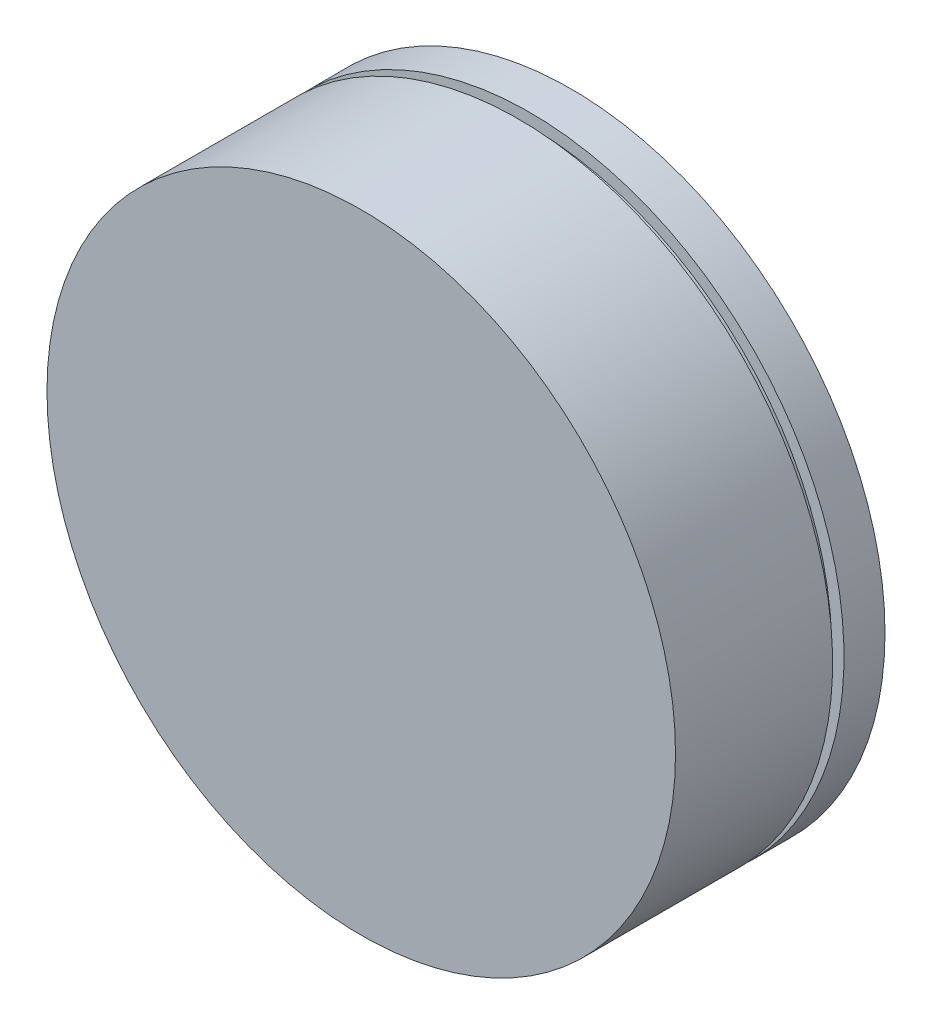
ISO-10303-21;
HEADER;
FILE_DESCRIPTION(('STEP AP214'),'2;1');
FILE_NAME('part.step','',(''),(''),'','','');
FILE_SCHEMA(('AUTOMOTIVE_DESIGN { 1 0 10303 214 1 1 1 1 }'));
ENDSEC;
DATA;
#1=APPLICATION_CONTEXT('core data for automotive mechanical design processes');
#2=APPLICATION_PROTOCOL_DEFINITION('international standard','automotive_design',2000,#1);
#3=PRODUCT_CONTEXT('',#1,'mechanical');
#4=PRODUCT('Part','Part','',(#3));
#5=PRODUCT_RELATED_PRODUCT_CATEGORY('part','',(#4));
#6=PRODUCT_DEFINITION_FORMATION('','',#4);
#7=PRODUCT_DEFINITION_CONTEXT('part definition',#1,'design');
#8=PRODUCT_DEFINITION('design','',#6,#7);
#9=PRODUCT_DEFINITION_SHAPE('','',#8);
#10=(LENGTH_UNIT() NAMED_UNIT(*) SI_UNIT(.MILLI.,.METRE.));
#11=(NAMED_UNIT(*) PLANE_ANGLE_UNIT() SI_UNIT($,.RADIAN.));
#12=(NAMED_UNIT(*) SI_UNIT($,.STERADIAN.) SOLID_ANGLE_UNIT());
#13=UNCERTAINTY_MEASURE_WITH_UNIT(LENGTH_MEASURE(1.E-05),#10,'distance_accuracy_value','');
#14=(GEOMETRIC_REPRESENTATION_CONTEXT(3) GLOBAL_UNCERTAINTY_ASSIGNED_CONTEXT((#13)) GLOBAL_UNIT_ASSIGNED_CONTEXT((#10,
#11,#12)) REPRESENTATION_CONTEXT('',''));
#15=CARTESIAN_POINT('',(0.,0.,0.));
#16=DIRECTION('',(0.,0.,1.));
#17=DIRECTION('',(1.,0.,0.));
#18=AXIS2_PLACEMENT_3D('',#15,#16,#17);
#19=CARTESIAN_POINT('',(0.,0.,25.4));
#20=DIRECTION('',(0.,0.,-1.));
#21=DIRECTION('',(-1.,0.,0.));
#22=AXIS2_PLACEMENT_3D('',#19,#20,#21);
#23=CYLINDRICAL_SURFACE('',#22,38.1);
#24=CARTESIAN_POINT('',(0.,0.,4.97177645782297));
#25=DIRECTION('',(0.,0.,-1.));
#26=DIRECTION('',(-1.,0.,0.));
#27=AXIS2_PLACEMENT_3D('',#24,#25,#26);
#28=CIRCLE('',#27,38.1);
#29=CARTESIAN_POINT('',(-38.1,0.,4.97177645782297));
#30=VERTEX_POINT('',#29);
#31=EDGE_CURVE('E47',#30,#30,#28,.T.);
#32=ORIENTED_EDGE('',*,*,#31,.T.);
#33=EDGE_LOOP('',(#32));
#34=FACE_BOUND('',#33,.T.);
#35=CARTESIAN_POINT('',(0.,0.,0.));
#36=DIRECTION('',(0.,0.,1.));
#37=DIRECTION('',(1.,0.,0.));
#38=AXIS2_PLACEMENT_3D('',#35,#36,#37);
#39=CIRCLE('',#38,38.1);
#40=CARTESIAN_POINT('',(38.1,0.,0.));
#41=VERTEX_POINT('',#40);
#42=EDGE_CURVE('E38',#41,#41,#39,.T.);
#43=ORIENTED_EDGE('',*,*,#42,.T.);
#44=EDGE_LOOP('',(#43));
#45=FACE_BOUND('',#44,.T.);
#46=ADVANCED_FACE('F34',(#34,#45),#23,.T.);
#47=CARTESIAN_POINT('',(0.,0.,0.));
#48=DIRECTION('',(0.,0.,1.));
#49=DIRECTION('',(1.,0.,0.));
#50=AXIS2_PLACEMENT_3D('',#47,#48,#49);
#51=PLANE('',#50);
#52=ORIENTED_EDGE('',*,*,#42,.F.);
#53=EDGE_LOOP('',(#52));
#54=FACE_BOUND('',#53,.T.);
#55=ADVANCED_FACE('F75',(#54),#51,.F.);
#56=CARTESIAN_POINT('',(-38.1,0.,4.97177645782297));
#57=DIRECTION('',(0.,0.,-1.));
#58=DIRECTION('',(-1.,0.,0.));
#59=AXIS2_PLACEMENT_3D('',#56,#57,#58);
#60=PLANE('',#59);
#61=ORIENTED_EDGE('',*,*,#31,.F.);
#62=EDGE_LOOP('',(#61));
#63=FACE_BOUND('',#62,.T.);
#64=CARTESIAN_POINT('',(0.,0.,4.97177645782297));
#65=DIRECTION('',(0.,0.,-1.));
#66=DIRECTION('',(-1.,0.,0.));
#67=AXIS2_PLACEMENT_3D('',#64,#65,#66);
#68=CIRCLE('',#67,36.6234041752429);
#69=CARTESIAN_POINT('',(-36.6234041752429,0.,4.97177645782297));
#70=VERTEX_POINT('',#69);
#71=EDGE_CURVE('E52',#70,#70,#68,.T.);
#72=ORIENTED_EDGE('',*,*,#71,.T.);
#73=EDGE_LOOP('',(#72));
#74=FACE_BOUND('',#73,.T.);
#75=ADVANCED_FACE('F80',(#63,#74),#60,.F.);
#76=CARTESIAN_POINT('',(0.,0.,0.));
#77=DIRECTION('',(0.,0.,-1.));
#78=DIRECTION('',(-1.,0.,0.));
#79=AXIS2_PLACEMENT_3D('',#76,#77,#78);
#80=CYLINDRICAL_SURFACE('',#79,36.6234041752429);
#81=ORIENTED_EDGE('',*,*,#71,.F.);
#82=EDGE_LOOP('',(#81));
#83=FACE_BOUND('',#82,.T.);
#84=CARTESIAN_POINT('',(0.,0.,6.35));
#85=DIRECTION('',(0.,0.,-1.));
#86=DIRECTION('',(-1.,0.,0.));
#87=AXIS2_PLACEMENT_3D('',#84,#85,#86);
#88=CIRCLE('',#87,36.6234041752429);
#89=CARTESIAN_POINT('',(-36.6234041752429,0.,6.35));
#90=VERTEX_POINT('',#89);
#91=EDGE_CURVE('E56',#90,#90,#88,.T.);
#92=ORIENTED_EDGE('',*,*,#91,.T.);
#93=EDGE_LOOP('',(#92));
#94=FACE_BOUND('',#93,.T.);
#95=ADVANCED_FACE('F88',(#83,#94),#80,.T.);
#96=CARTESIAN_POINT('',(-36.6234041752429,0.,6.35));
#97=DIRECTION('',(0.,0.,1.));
#98=DIRECTION('',(1.,0.,0.));
#99=AXIS2_PLACEMENT_3D('',#96,#97,#98);
#100=PLANE('',#99);
#101=ORIENTED_EDGE('',*,*,#91,.F.);
#102=EDGE_LOOP('',(#101));
#103=FACE_BOUND('',#102,.T.);
#104=CARTESIAN_POINT('',(0.,0.,6.35));
#105=DIRECTION('',(0.,0.,-1.));
#106=DIRECTION('',(-1.,0.,0.));
#107=AXIS2_PLACEMENT_3D('',#104,#105,#106);
#108=CIRCLE('',#107,38.1);
#109=CARTESIAN_POINT('',(-38.1,0.,6.35));
#110=VERTEX_POINT('',#109);
#111=EDGE_CURVE('E60',#110,#110,#108,.T.);
#112=ORIENTED_EDGE('',*,*,#111,.T.);
#113=EDGE_LOOP('',(#112));
#114=FACE_BOUND('',#113,.T.);
#115=ADVANCED_FACE('F65',(#103,#114),#100,.F.);
#116=CARTESIAN_POINT('',(0.,0.,25.4));
#117=DIRECTION('',(0.,0.,1.));
#118=DIRECTION('',(1.,0.,0.));
#119=AXIS2_PLACEMENT_3D('',#116,#117,#118);
#120=PLANE('',#119);
#121=CARTESIAN_POINT('',(0.,0.,25.4));
#122=DIRECTION('',(0.,0.,1.));
#123=DIRECTION('',(1.,0.,0.));
#124=AXIS2_PLACEMENT_3D('',#121,#122,#123);
#125=CIRCLE('',#124,38.1);
#126=CARTESIAN_POINT('',(38.1,0.,25.4));
#127=VERTEX_POINT('',#126);
#128=EDGE_CURVE('E10',#127,#127,#125,.T.);
#129=ORIENTED_EDGE('',*,*,#128,.T.);
#130=EDGE_LOOP('',(#129));
#131=FACE_BOUND('',#130,.T.);
#132=ADVANCED_FACE('F69',(#131),#120,.T.);
#133=ORIENTED_EDGE('',*,*,#111,.F.);
#134=EDGE_LOOP('',(#133));
#135=FACE_BOUND('',#134,.T.);
#136=ORIENTED_EDGE('',*,*,#128,.F.);
#137=EDGE_LOOP('',(#136));
#138=FACE_BOUND('',#137,.T.);
#139=ADVANCED_FACE('F36',(#135,#138),#23,.T.);
#140=CLOSED_SHELL('',(#46,#55,#75,#95,#115,#132,#139));
#141=MANIFOLD_SOLID_BREP('B2',#140);
#142=ADVANCED_BREP_SHAPE_REPRESENTATION('',(#18,#141),#14);
#143=SHAPE_DEFINITION_REPRESENTATION(#9,#142);
ENDSEC;
END-ISO-10303-21;
